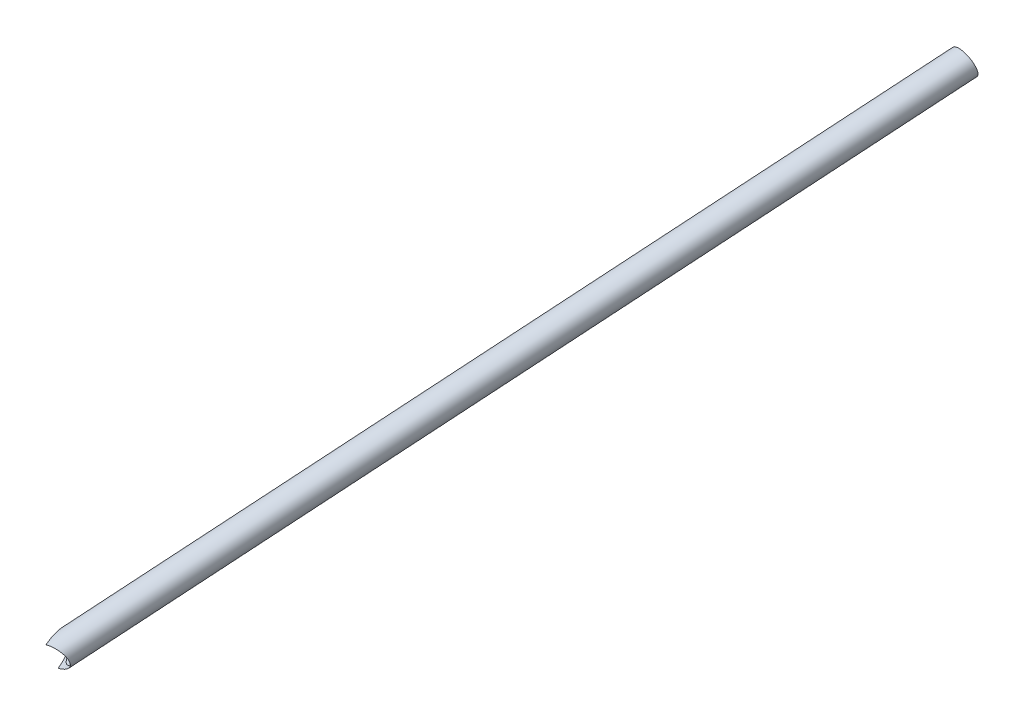
ISO-10303-21;
HEADER;
FILE_DESCRIPTION(('STEP AP214'),'2;1');
FILE_NAME('part.step','',(''),(''),'','','');
FILE_SCHEMA(('AUTOMOTIVE_DESIGN { 1 0 10303 214 1 1 1 1 }'));
ENDSEC;
DATA;
#1=APPLICATION_CONTEXT('core data for automotive mechanical design processes');
#2=APPLICATION_PROTOCOL_DEFINITION('international standard','automotive_design',2000,#1);
#3=PRODUCT_CONTEXT('',#1,'mechanical');
#4=PRODUCT('Part','Part','',(#3));
#5=PRODUCT_RELATED_PRODUCT_CATEGORY('part','',(#4));
#6=PRODUCT_DEFINITION_FORMATION('','',#4);
#7=PRODUCT_DEFINITION_CONTEXT('part definition',#1,'design');
#8=PRODUCT_DEFINITION('design','',#6,#7);
#9=PRODUCT_DEFINITION_SHAPE('','',#8);
#10=(LENGTH_UNIT() NAMED_UNIT(*) SI_UNIT(.MILLI.,.METRE.));
#11=(NAMED_UNIT(*) PLANE_ANGLE_UNIT() SI_UNIT($,.RADIAN.));
#12=(NAMED_UNIT(*) SI_UNIT($,.STERADIAN.) SOLID_ANGLE_UNIT());
#13=UNCERTAINTY_MEASURE_WITH_UNIT(LENGTH_MEASURE(1.E-05),#10,'distance_accuracy_value','');
#14=(GEOMETRIC_REPRESENTATION_CONTEXT(3) GLOBAL_UNCERTAINTY_ASSIGNED_CONTEXT((#13)) GLOBAL_UNIT_ASSIGNED_CONTEXT((#10,
#11,#12)) REPRESENTATION_CONTEXT('',''));
#15=CARTESIAN_POINT('',(0.,0.,0.));
#16=DIRECTION('',(0.,0.,1.));
#17=DIRECTION('',(1.,0.,0.));
#18=AXIS2_PLACEMENT_3D('',#15,#16,#17);
#19=CARTESIAN_POINT('',(-225.,200.,-200.));
#20=DIRECTION('',(0.313257210262409,0.388871019636094,-0.866400167535647));
#21=DIRECTION('',(0.,0.912318699307092,0.409480879766828));
#22=AXIS2_PLACEMENT_3D('',#19,#20,#21);
#23=CYLINDRICAL_SURFACE('',#22,7.1);
#24=CARTESIAN_POINT('',(-79.9999999999999,380.,-601.037933611912));
#25=DIRECTION('',(0.0966021654991003,0.31145037677638,-0.945339454601751));
#26=DIRECTION('',(0.909209641489906,0.358833563956318,0.211131004829239));
#27=AXIS2_PLACEMENT_3D('',#24,#25,#26);
#28=ELLIPSE('',#27,7.31643769653913,7.1);
#29=CARTESIAN_POINT('',(-73.3478243049463,382.625383414114,-599.493206769271));
#30=VERTEX_POINT('',#29);
#31=EDGE_CURVE('E87',#30,#30,#28,.T.);
#32=ORIENTED_EDGE('',*,*,#31,.T.);
#33=EDGE_LOOP('',(#32));
#34=FACE_BOUND('',#33,.T.);
#35=CARTESIAN_POINT('',(-223.730651961237,208.053205158028,-200.603421715724));
#36=CARTESIAN_POINT('',(-223.845390516023,208.096232098437,-200.699286821838));
#37=CARTESIAN_POINT('',(-223.954301038716,208.137993509112,-200.802733536949));
#38=CARTESIAN_POINT('',(-224.160451344867,208.219028271808,-201.021642929305));
#39=CARTESIAN_POINT('',(-224.257675567579,208.2582982743,-201.137121253594));
#40=CARTESIAN_POINT('',(-224.442023960751,208.334573176719,-201.377810136538));
#41=CARTESIAN_POINT('',(-224.529075057838,208.371560883253,-201.503081461319));
#42=CARTESIAN_POINT('',(-224.693878985637,208.443004565111,-201.760344554358));
#43=CARTESIAN_POINT('',(-224.771624964531,208.477458667707,-201.892341174054));
#44=CARTESIAN_POINT('',(-224.931671774545,208.549359767701,-202.183772193055));
#45=CARTESIAN_POINT('',(-225.012550593245,208.586339954172,-202.3440962071));
#46=CARTESIAN_POINT('',(-225.165732338599,208.656737731649,-202.669475176112));
#47=CARTESIAN_POINT('',(-225.238036118823,208.69015567721,-202.834529658167));
#48=CARTESIAN_POINT('',(-225.375875854835,208.753403742801,-203.168447640188));
#49=CARTESIAN_POINT('',(-225.441399493951,208.783227349062,-203.337317415975));
#50=CARTESIAN_POINT('',(-225.566830840428,208.839099292548,-203.677762997587));
#51=CARTESIAN_POINT('',(-225.626737595338,208.865146989903,-203.849339256606));
#52=CARTESIAN_POINT('',(-225.742140414593,208.913406755739,-204.195292606392));
#53=CARTESIAN_POINT('',(-225.797617380799,208.935602654269,-204.36967829844));
#54=CARTESIAN_POINT('',(-225.904630991435,208.975839746303,-204.720134781211));
#55=CARTESIAN_POINT('',(-225.956167306241,208.9938805925,-204.896205711516));
#56=CARTESIAN_POINT('',(-226.105640855257,209.041416211562,-205.426056958927));
#57=CARTESIAN_POINT('',(-226.198570750274,209.064379736479,-205.781869793198));
#58=CARTESIAN_POINT('',(-226.379144475247,209.091478299634,-206.517643697949));
#59=CARTESIAN_POINT('',(-226.466162190769,209.094434815798,-206.897801002318));
#60=CARTESIAN_POINT('',(-226.630383422734,209.07495341383,-207.660018073201));
#61=CARTESIAN_POINT('',(-226.70757974136,209.052496989196,-208.042079024174));
#62=CARTESIAN_POINT('',(-226.816096122883,208.996331849491,-208.612921938084));
#63=CARTESIAN_POINT('',(-226.850948380074,208.973977694967,-208.802185047289));
#64=CARTESIAN_POINT('',(-226.918307342143,208.921086226095,-209.179972998551));
#65=CARTESIAN_POINT('',(-226.950814427725,208.890550243764,-209.368497955717));
#66=CARTESIAN_POINT('',(-227.013364723598,208.820483549382,-209.744067689987));
#67=CARTESIAN_POINT('',(-227.043410668596,208.780963010172,-209.931113895453));
#68=CARTESIAN_POINT('',(-227.100911165196,208.691918679765,-210.303182618966));
#69=CARTESIAN_POINT('',(-227.12836649423,208.642397903691,-210.488205729302));
#70=CARTESIAN_POINT('',(-227.173934394767,208.545975282153,-210.809387040045));
#71=CARTESIAN_POINT('',(-227.192665903546,208.501517759109,-210.946189622674));
#72=CARTESIAN_POINT('',(-227.22839777077,208.405771987455,-211.217595213607));
#73=CARTESIAN_POINT('',(-227.245398247,208.354484204153,-211.352198371044));
#74=CARTESIAN_POINT('',(-227.293603725238,208.189345476155,-211.752141490801));
#75=CARTESIAN_POINT('',(-227.321976153079,208.064293234726,-212.013358876155));
#76=CARTESIAN_POINT('',(-227.369591642088,207.777350892739,-212.520298884232));
#77=CARTESIAN_POINT('',(-227.388727557785,207.615059236812,-212.765812270946));
#78=CARTESIAN_POINT('',(-227.408298586002,207.341721062181,-213.110483145228));
#79=CARTESIAN_POINT('',(-227.413299808292,207.245702445358,-213.221370933683));
#80=CARTESIAN_POINT('',(-227.419946504981,207.043497256899,-213.433512140549));
#81=CARTESIAN_POINT('',(-227.421593536649,206.937315427782,-213.53477000907));
#82=CARTESIAN_POINT('',(-227.42114559304,206.665812332733,-213.767791152334));
#83=CARTESIAN_POINT('',(-227.417082980818,206.495041656201,-213.893347432685));
#84=CARTESIAN_POINT('',(-227.400809586954,206.135481691323,-214.114389587522));
#85=CARTESIAN_POINT('',(-227.388605238149,205.946706729116,-214.209899114532));
#86=CARTESIAN_POINT('',(-227.356194403225,205.55606484054,-214.3672619937));
#87=CARTESIAN_POINT('',(-227.335981182214,205.354187015379,-214.429086915306));
#88=CARTESIAN_POINT('',(-227.288428078613,204.943813144819,-214.518549617761));
#89=CARTESIAN_POINT('',(-227.261082479231,204.73531190885,-214.546159872079));
#90=CARTESIAN_POINT('',(-227.192179626053,204.259821852231,-214.572963799322));
#91=CARTESIAN_POINT('',(-227.148782944323,203.992567483208,-214.562215704883));
#92=CARTESIAN_POINT('',(-227.055037630588,203.464489570764,-214.498071141852));
#93=CARTESIAN_POINT('',(-227.004675365016,203.203679851032,-214.444590027547));
#94=CARTESIAN_POINT('',(-226.910720640852,202.749200506403,-214.3196049761));
#95=CARTESIAN_POINT('',(-226.868092652827,202.553433783826,-214.254698451845));
#96=CARTESIAN_POINT('',(-226.780436268908,202.168799146939,-214.108016565052));
#97=CARTESIAN_POINT('',(-226.735406466332,201.979935387089,-214.026231234775));
#98=CARTESIAN_POINT('',(-226.643325343962,201.609104914485,-213.848590523681));
#99=CARTESIAN_POINT('',(-226.596270602768,201.427150937794,-213.752710610616));
#100=CARTESIAN_POINT('',(-226.500464037067,201.070305375506,-213.549274419419));
#101=CARTESIAN_POINT('',(-226.451711580304,200.895416474586,-213.441713758896));
#102=CARTESIAN_POINT('',(-226.357011499313,200.567548751045,-213.226636143112));
#103=CARTESIAN_POINT('',(-226.311191740133,200.413991830563,-213.11993896315));
#104=CARTESIAN_POINT('',(-226.218314356823,200.112399906777,-212.899490460151));
#105=CARTESIAN_POINT('',(-226.17125652232,199.964365852378,-212.785737933764));
#106=CARTESIAN_POINT('',(-226.028163380723,199.528051282672,-212.43517364472));
#107=CARTESIAN_POINT('',(-225.930257420194,199.247727443922,-212.189168524074));
#108=CARTESIAN_POINT('',(-225.728645961178,198.706568086822,-211.678024142143));
#109=CARTESIAN_POINT('',(-225.624930422105,198.445768249661,-211.41285150903));
#110=CARTESIAN_POINT('',(-225.410272168171,197.943381497068,-210.867913803414));
#111=CARTESIAN_POINT('',(-225.299333073471,197.701785090416,-210.588156054197));
#112=CARTESIAN_POINT('',(-225.102001254453,197.307177941087,-210.102763849939));
#113=CARTESIAN_POINT('',(-225.018201517672,197.149298159864,-209.900009003897));
#114=CARTESIAN_POINT('',(-224.843987154775,196.843301511844,-209.490027584026));
#115=CARTESIAN_POINT('',(-224.753573354355,196.695183430778,-209.282801570644));
#116=CARTESIAN_POINT('',(-224.564011660237,196.409888511063,-208.865570120095));
#117=CARTESIAN_POINT('',(-224.464883227934,196.272688534134,-208.655571723419));
#118=CARTESIAN_POINT('',(-224.254354920462,196.01062320661,-208.234062235731));
#119=CARTESIAN_POINT('',(-224.142963024337,195.885749934978,-208.022552211042));
#120=CARTESIAN_POINT('',(-223.963272405064,195.710523154333,-207.706801357994));
#121=CARTESIAN_POINT('',(-223.901483018758,195.654281785785,-207.602121200888));
#122=CARTESIAN_POINT('',(-223.772835884169,195.546321279963,-207.393566567533));
#123=CARTESIAN_POINT('',(-223.70597951725,195.494600918389,-207.289691880148));
#124=CARTESIAN_POINT('',(-223.566360781232,195.396537296507,-207.083452323129));
#125=CARTESIAN_POINT('',(-223.49360258688,195.350190290687,-206.981086445749));
#126=CARTESIAN_POINT('',(-223.341335076927,195.263940676864,-206.778746900266));
#127=CARTESIAN_POINT('',(-223.261827341276,195.224036567003,-206.678772679302));
#128=CARTESIAN_POINT('',(-223.043997666409,195.129882304449,-206.42196791205));
#129=CARTESIAN_POINT('',(-222.899490245827,195.081824778747,-206.267836493955));
#130=CARTESIAN_POINT('',(-222.667755703829,195.029635775293,-206.048146582887));
#131=CARTESIAN_POINT('',(-222.588062880131,195.015557921421,-205.976870264897));
#132=CARTESIAN_POINT('',(-222.424068895939,194.994621850162,-205.838716997335));
#133=CARTESIAN_POINT('',(-222.339769763907,194.987760481409,-205.771838139407));
#134=CARTESIAN_POINT('',(-222.166981315114,194.981658467693,-205.642732330556));
#135=CARTESIAN_POINT('',(-222.078478927664,194.982443386061,-205.580521685405));
#136=CARTESIAN_POINT('',(-221.898522147264,194.991806004242,-205.461174601967));
#137=CARTESIAN_POINT('',(-221.807067670727,195.000383924901,-205.404038307533));
#138=CARTESIAN_POINT('',(-221.622095019979,195.025182963625,-205.294596979109));
#139=CARTESIAN_POINT('',(-221.528573139695,195.041419085465,-205.242301671129));
#140=CARTESIAN_POINT('',(-221.340635393913,195.081153788782,-205.142251762953));
#141=CARTESIAN_POINT('',(-221.246219237348,195.104654819492,-205.094498701202));
#142=CARTESIAN_POINT('',(-221.020022550034,195.16906261972,-204.984862989536));
#143=CARTESIAN_POINT('',(-220.888239332931,195.213177120656,-204.924865640062));
#144=CARTESIAN_POINT('',(-220.626543046062,195.313146582972,-204.810895232744));
#145=CARTESIAN_POINT('',(-220.496630825241,195.369006704953,-204.756924838937));
#146=CARTESIAN_POINT('',(-220.239755593939,195.491273491825,-204.653262898103));
#147=CARTESIAN_POINT('',(-220.112799376258,195.557702136414,-204.603580608879));
#148=CARTESIAN_POINT('',(-219.863056289767,195.699923931504,-204.507199927433));
#149=CARTESIAN_POINT('',(-219.740270550838,195.775719594356,-204.460502340864));
#150=CARTESIAN_POINT('',(-219.455516325475,195.965086689994,-204.35215063648));
#151=CARTESIAN_POINT('',(-219.29567544139,196.082323569889,-204.291285663066));
#152=CARTESIAN_POINT('',(-218.986682827158,196.330698686477,-204.170716757183));
#153=CARTESIAN_POINT('',(-218.837534259696,196.461841008064,-204.111013172014));
#154=CARTESIAN_POINT('',(-218.551303779893,196.736439193914,-203.991222143402));
#155=CARTESIAN_POINT('',(-218.414218007492,196.879891089914,-203.9311348294));
#156=CARTESIAN_POINT('',(-218.153294667963,197.177779393262,-203.809464315172));
#157=CARTESIAN_POINT('',(-218.029456507806,197.332215308396,-203.747881182057));
#158=CARTESIAN_POINT('',(-217.795605375675,197.651603555708,-203.622163602816));
#159=CARTESIAN_POINT('',(-217.685666733624,197.816605860185,-203.558017670362));
#160=CARTESIAN_POINT('',(-217.481525896164,198.155077694865,-203.427025631308));
#161=CARTESIAN_POINT('',(-217.387324135838,198.328547459,-203.360179450117));
#162=CARTESIAN_POINT('',(-217.215794390987,198.682473914076,-203.223614380315));
#163=CARTESIAN_POINT('',(-217.138459798943,198.862927836316,-203.153896629379));
#164=CARTESIAN_POINT('',(-217.001615146109,199.229375262774,-203.011577210755));
#165=CARTESIAN_POINT('',(-216.942104026307,199.415368437146,-202.9389757147));
#166=CARTESIAN_POINT('',(-216.844022789543,199.782739663219,-202.794450120388));
#167=CARTESIAN_POINT('',(-216.804624029622,199.963943418664,-202.722645133784));
#168=CARTESIAN_POINT('',(-216.743385429664,200.328454868449,-202.576905526247));
#169=CARTESIAN_POINT('',(-216.721545159544,200.511762511145,-202.502970957523));
#170=CARTESIAN_POINT('',(-216.695782193964,200.878898936062,-202.35343376166));
#171=CARTESIAN_POINT('',(-216.69185453081,201.062727559647,-202.277831602837));
#172=CARTESIAN_POINT('',(-216.702030606066,201.429407336211,-202.125487616629));
#173=CARTESIAN_POINT('',(-216.716133519363,201.612258533534,-202.048745841553));
#174=CARTESIAN_POINT('',(-216.760759095097,201.963712071455,-201.899741240844));
#175=CARTESIAN_POINT('',(-216.790160881641,202.132471148568,-201.82750972046));
#176=CARTESIAN_POINT('',(-216.864351604792,202.466631080087,-201.683176139547));
#177=CARTESIAN_POINT('',(-216.90914066589,202.632031907309,-201.611074080072));
#178=CARTESIAN_POINT('',(-217.013647795814,202.958349302294,-201.46762534802));
#179=CARTESIAN_POINT('',(-217.073363854961,203.119266470469,-201.396278575103));
#180=CARTESIAN_POINT('',(-217.207130310704,203.435657556659,-201.254973409856));
#181=CARTESIAN_POINT('',(-217.281181007141,203.591131360733,-201.185015046601));
#182=CARTESIAN_POINT('',(-217.44328752746,203.896512737467,-201.046825599483));
#183=CARTESIAN_POINT('',(-217.531409321405,204.0463897701,-200.978604499984));
#184=CARTESIAN_POINT('',(-217.720605024888,204.339100998007,-200.844930923043));
#185=CARTESIAN_POINT('',(-217.821683016196,204.481932954049,-200.779479326796));
#186=CARTESIAN_POINT('',(-218.035903955393,204.759957916869,-200.652101559136));
#187=CARTESIAN_POINT('',(-218.149049381418,204.895149345854,-200.590176115864));
#188=CARTESIAN_POINT('',(-218.386466240457,205.157444597798,-200.470668079464));
#189=CARTESIAN_POINT('',(-218.510738438216,205.284547863826,-200.413085785345));
#190=CARTESIAN_POINT('',(-218.77832181141,205.538806051364,-200.299396215757));
#191=CARTESIAN_POINT('',(-218.922353988086,205.665368562885,-200.243659925843));
#192=CARTESIAN_POINT('',(-219.220823484933,205.908752275785,-200.13945332325));
#193=CARTESIAN_POINT('',(-219.375258128449,206.025575965877,-200.090981151718));
#194=CARTESIAN_POINT('',(-219.693449793898,206.249622760481,-200.002810964339));
#195=CARTESIAN_POINT('',(-219.857211655218,206.356840805537,-199.963117556438));
#196=CARTESIAN_POINT('',(-220.192683203444,206.561831455523,-199.894513495773));
#197=CARTESIAN_POINT('',(-220.364390491493,206.659606884168,-199.865599612059));
#198=CARTESIAN_POINT('',(-220.665444725285,206.820156799753,-199.827352502512));
#199=CARTESIAN_POINT('',(-220.793243534903,206.885085317876,-199.814806906877));
#200=CARTESIAN_POINT('',(-221.051507605542,207.010538952926,-199.797914881889));
#201=CARTESIAN_POINT('',(-221.181972221748,207.071065118934,-199.793566492946));
#202=CARTESIAN_POINT('',(-221.444469079179,207.187937995565,-199.794551276549));
#203=CARTESIAN_POINT('',(-221.57649810134,207.244291983731,-199.799867156817));
#204=CARTESIAN_POINT('',(-221.841138897727,207.353305243127,-199.821874093158));
#205=CARTESIAN_POINT('',(-221.973750441085,207.405965858509,-199.838560986969));
#206=CARTESIAN_POINT('',(-222.204157263125,207.49496795595,-199.879174474764));
#207=CARTESIAN_POINT('',(-222.302189086296,207.532040604546,-199.900160997738));
#208=CARTESIAN_POINT('',(-222.49680216997,207.604537357362,-199.950130483006));
#209=CARTESIAN_POINT('',(-222.59338388781,207.639961989059,-199.979110865851));
#210=CARTESIAN_POINT('',(-222.783979125561,207.709266493033,-200.045528981562));
#211=CARTESIAN_POINT('',(-222.877996675931,207.743148853202,-200.082952468204));
#212=CARTESIAN_POINT('',(-223.062563808436,207.809540950205,-200.166475015495));
#213=CARTESIAN_POINT('',(-223.153114756244,207.8420512281,-200.212570616526));
#214=CARTESIAN_POINT('',(-223.327630970693,207.905002026187,-200.312003233358));
#215=CARTESIAN_POINT('',(-223.411704178314,207.935473948332,-200.365130897721));
#216=CARTESIAN_POINT('',(-223.574930763377,207.995219369737,-200.47885924508));
#217=CARTESIAN_POINT('',(-223.65408887626,208.024494012929,-200.539452561855));
#218=CARTESIAN_POINT('',(-223.730651961237,208.053205158028,-200.603421715724));
#219=B_SPLINE_CURVE_WITH_KNOTS('',3,(#35,#36,#37,#38,#39,#40,#41,#42,#43,#44,#45,#46,#47,#48,
#49,#50,#51,#52,#53,#54,#55,#56,#57,#58,#59,#60,#61,#62,#63,#64,#65,#66,#67,#68,#69,#70,#71,#72,
#73,#74,#75,#76,#77,#78,#79,#80,#81,#82,#83,#84,#85,#86,#87,#88,#89,#90,#91,#92,#93,#94,#95,#96,
#97,#98,#99,#100,#101,#102,#103,#104,#105,#106,#107,#108,#109,#110,#111,#112,#113,#114,#115,
#116,#117,#118,#119,#120,#121,#122,#123,#124,#125,#126,#127,#128,#129,#130,#131,#132,#133,#134,
#135,#136,#137,#138,#139,#140,#141,#142,#143,#144,#145,#146,#147,#148,#149,#150,#151,#152,#153,
#154,#155,#156,#157,#158,#159,#160,#161,#162,#163,#164,#165,#166,#167,#168,#169,#170,#171,#172,
#173,#174,#175,#176,#177,#178,#179,#180,#181,#182,#183,#184,#185,#186,#187,#188,#189,#190,#191,
#192,#193,#194,#195,#196,#197,#198,#199,#200,#201,#202,#203,#204,#205,#206,#207,#208,#209,#210,
#211,#212,#213,#214,#215,#216,#217,#218),.UNSPECIFIED.,.T.,.F.,(4,2,2,2,2,2,2,2,2,2,2,2,2,2,2,2,
2,2,2,2,2,2,2,2,2,2,2,2,2,2,2,2,2,2,2,2,2,2,2,2,2,2,2,2,2,2,2,2,2,2,2,2,2,2,2,2,2,2,2,2,2,2,2,2,
2,2,2,2,2,2,2,2,2,2,2,2,2,2,2,2,2,2,2,2,2,2,2,2,2,2,2,4),(0.,0.466574246566559,
0.933763029025926,1.40412449708417,1.874830211966,2.42445989769073,2.97403482663816,
3.52459119507023,4.07524075277546,4.62814879101381,5.18110302799334,6.28575946058562,
7.45495966593218,8.62501186778999,9.20607914372038,9.78705187817089,10.367370048874,
10.947513511152,11.3825161714488,11.817489212504,12.6882387275024,13.5688598586037,
14.0085560119983,14.4480479785965,15.0811101277557,15.7136726820482,16.3467683093103,
16.9803729473902,17.7887879095768,18.5988081644142,19.22976926755,19.8611040550336,
20.4935510131694,21.1262360783329,21.703558228815,22.280979118733,23.4364468170897,
24.5939771020896,25.7509316780587,26.5615617282502,27.3720907522007,28.180853587508,
28.9890932885347,29.3907643896467,29.7923263780675,30.193606752022,30.5947934508797,
31.2418150242471,31.5649731067884,31.8879900107976,32.2120872057502,32.5361935855828,
32.8609376016621,33.1857912189002,33.6391794746142,34.0927673504875,34.5473112051933,
35.0019772398895,35.6232356243441,36.244677019362,36.8659188262729,37.4871328116676,
38.1115397012153,38.7359638511341,39.3601429489823,39.984284952827,40.580067472229,
41.1758353979132,41.7714380894805,42.3670135260817,42.924072139857,43.4811352606566,
44.0381234222769,44.5951232358409,45.1548155723843,45.7146846719711,46.274668966968,
46.8346917794033,47.4330615746001,48.031277987254,48.6298076605345,49.2281577918967,
49.6595592300553,50.0908575261003,50.5213848594639,50.9517546865847,51.2721376462972,
51.5924173459525,51.9121606200235,52.2317766064754,52.5434187263513,52.8547557808806),.UNSPECIFIED.);
#220=CARTESIAN_POINT('',(-223.730651961237,208.053205158028,-200.603421715724));
#221=VERTEX_POINT('',#220);
#222=EDGE_CURVE('E81',#221,#221,#219,.T.);
#223=ORIENTED_EDGE('',*,*,#222,.T.);
#224=EDGE_LOOP('',(#223));
#225=FACE_BOUND('',#224,.T.);
#226=ADVANCED_FACE('F41',(#34,#225),#23,.F.);
#227=CARTESIAN_POINT('',(-80.,380.,-601.037933611912));
#228=DIRECTION('',(0.0966021654991003,0.31145037677638,-0.945339454601751));
#229=DIRECTION('',(0.,0.949781512459289,0.312913851707695));
#230=AXIS2_PLACEMENT_3D('',#227,#228,#229);
#231=PLANE('',#230);
#232=ORIENTED_EDGE('',*,*,#31,.F.);
#233=EDGE_LOOP('',(#232));
#234=FACE_BOUND('',#233,.T.);
#235=CARTESIAN_POINT('',(-79.9999999999999,380.,-601.037933611912));
#236=DIRECTION('',(0.0966021654991003,0.31145037677638,-0.945339454601751));
#237=DIRECTION('',(0.909209641489906,0.358833563956318,0.211131004829239));
#238=AXIS2_PLACEMENT_3D('',#235,#236,#237);
#239=ELLIPSE('',#238,8.24387346088917,8.);
#240=CARTESIAN_POINT('',(-72.5045907661367,382.958178494776,-599.297396324429));
#241=VERTEX_POINT('',#240);
#242=EDGE_CURVE('E57',#241,#241,#239,.T.);
#243=ORIENTED_EDGE('',*,*,#242,.T.);
#244=EDGE_LOOP('',(#243));
#245=FACE_BOUND('',#244,.T.);
#246=ADVANCED_FACE('F43',(#234,#245),#231,.T.);
#247=CARTESIAN_POINT('',(-225.,200.,-200.));
#248=DIRECTION('',(0.313257210262409,0.388871019636094,-0.866400167535647));
#249=DIRECTION('',(0.,0.912318699307092,0.409480879766828));
#250=AXIS2_PLACEMENT_3D('',#247,#248,#249);
#251=CYLINDRICAL_SURFACE('',#250,8.);
#252=ORIENTED_EDGE('',*,*,#242,.F.);
#253=EDGE_LOOP('',(#252));
#254=FACE_BOUND('',#253,.T.);
#255=CARTESIAN_POINT('',(-225.,200.,-200.));
#256=DIRECTION('',(0.979997411230481,0.1383871597552,-0.143017719169493));
#257=DIRECTION('',(-0.18494238420669,0.367901037751926,-0.911287627999525));
#258=AXIS2_PLACEMENT_3D('',#255,#256,#257);
#259=ELLIPSE('',#258,16.5044898743675,8.);
#260=CARTESIAN_POINT('',(-225.587953114076,207.356076434343,-196.910914273163));
#261=VERTEX_POINT('',#260);
#262=CARTESIAN_POINT('',(-224.412046885924,192.643923565657,-203.089085726837));
#263=VERTEX_POINT('',#262);
#264=EDGE_CURVE('E11',#261,#263,#259,.F.);
#265=ORIENTED_EDGE('',*,*,#264,.F.);
#266=CARTESIAN_POINT('',(-225.,200.,-200.));
#267=DIRECTION('',(-0.18494238420669,0.367901037751926,-0.911287627999525));
#268=DIRECTION('',(0.979997411230481,0.1383871597552,-0.143017719169493));
#269=AXIS2_PLACEMENT_3D('',#266,#267,#268);
#270=ELLIPSE('',#269,9.14629332778499,8.);
#271=EDGE_CURVE('E49',#263,#261,#270,.F.);
#272=ORIENTED_EDGE('',*,*,#271,.F.);
#273=EDGE_LOOP('',(#265,#272));
#274=FACE_BOUND('',#273,.T.);
#275=ADVANCED_FACE('F58',(#254,#274),#251,.T.);
#276=CARTESIAN_POINT('',(-225.,200.,-200.));
#277=DIRECTION('',(0.636784790371592,-0.254713916148637,0.727754046138963));
#278=DIRECTION('',(0.752576694706878,0.,-0.658504607868518));
#279=AXIS2_PLACEMENT_3D('',#276,#277,#278);
#280=CYLINDRICAL_SURFACE('',#279,8.);
#281=ORIENTED_EDGE('',*,*,#222,.F.);
#282=EDGE_LOOP('',(#281));
#283=FACE_BOUND('',#282,.T.);
#284=ORIENTED_EDGE('',*,*,#264,.T.);
#285=ORIENTED_EDGE('',*,*,#271,.T.);
#286=EDGE_LOOP('',(#284,#285));
#287=FACE_BOUND('',#286,.T.);
#288=ADVANCED_FACE('F55',(#283,#287),#280,.F.);
#289=CLOSED_SHELL('',(#226,#246,#275,#288));
#290=MANIFOLD_SOLID_BREP('B2',#289);
#291=ADVANCED_BREP_SHAPE_REPRESENTATION('',(#18,#290),#14);
#292=SHAPE_DEFINITION_REPRESENTATION(#9,#291);
ENDSEC;
END-ISO-10303-21;
